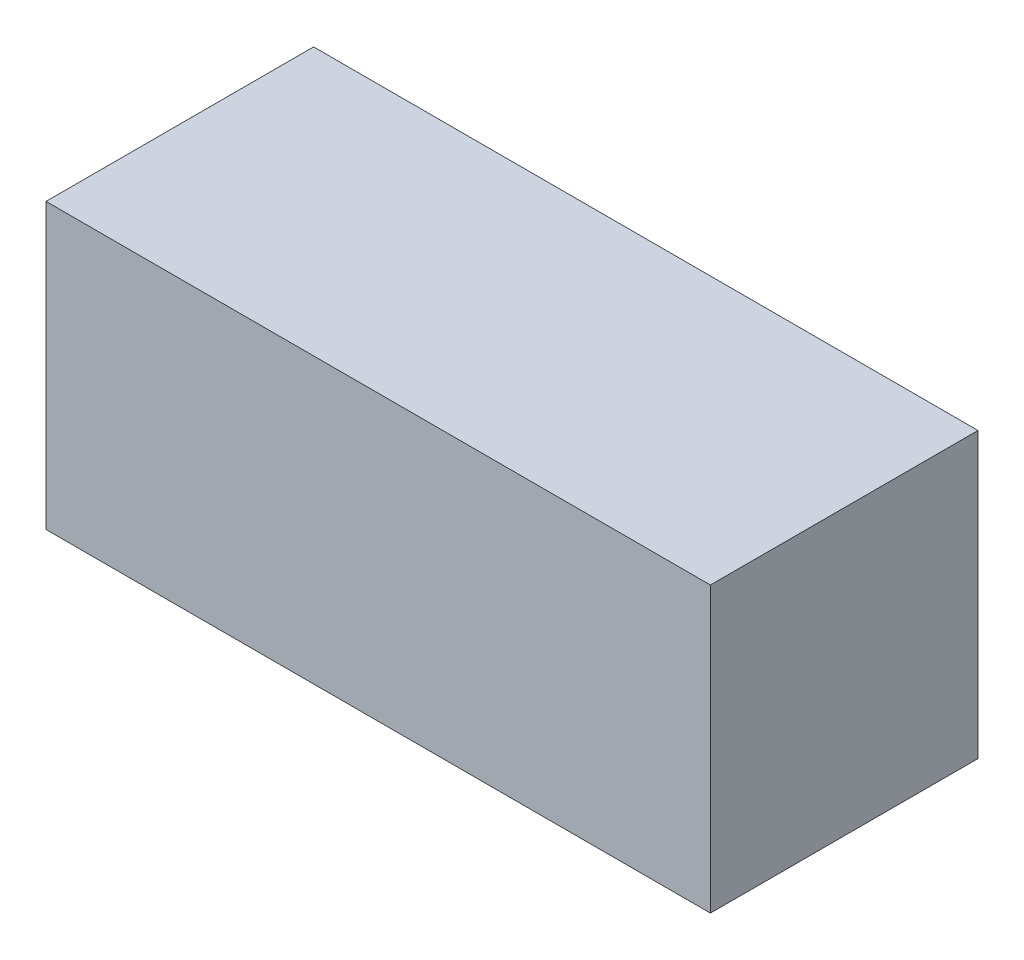
ISO-10303-21;
HEADER;
FILE_DESCRIPTION(('STEP AP214'),'2;1');
FILE_NAME('part.step','',(''),(''),'','','');
FILE_SCHEMA(('AUTOMOTIVE_DESIGN { 1 0 10303 214 1 1 1 1 }'));
ENDSEC;
DATA;
#1=APPLICATION_CONTEXT('core data for automotive mechanical design processes');
#2=APPLICATION_PROTOCOL_DEFINITION('international standard','automotive_design',2000,#1);
#3=PRODUCT_CONTEXT('',#1,'mechanical');
#4=PRODUCT('Part','Part','',(#3));
#5=PRODUCT_RELATED_PRODUCT_CATEGORY('part','',(#4));
#6=PRODUCT_DEFINITION_FORMATION('','',#4);
#7=PRODUCT_DEFINITION_CONTEXT('part definition',#1,'design');
#8=PRODUCT_DEFINITION('design','',#6,#7);
#9=PRODUCT_DEFINITION_SHAPE('','',#8);
#10=(LENGTH_UNIT() NAMED_UNIT(*) SI_UNIT(.MILLI.,.METRE.));
#11=(NAMED_UNIT(*) PLANE_ANGLE_UNIT() SI_UNIT($,.RADIAN.));
#12=(NAMED_UNIT(*) SI_UNIT($,.STERADIAN.) SOLID_ANGLE_UNIT());
#13=UNCERTAINTY_MEASURE_WITH_UNIT(LENGTH_MEASURE(1.E-05),#10,'distance_accuracy_value','');
#14=(GEOMETRIC_REPRESENTATION_CONTEXT(3) GLOBAL_UNCERTAINTY_ASSIGNED_CONTEXT((#13)) GLOBAL_UNIT_ASSIGNED_CONTEXT((#10,
#11,#12)) REPRESENTATION_CONTEXT('',''));
#15=CARTESIAN_POINT('',(0.,0.,0.));
#16=DIRECTION('',(0.,0.,1.));
#17=DIRECTION('',(1.,0.,0.));
#18=AXIS2_PLACEMENT_3D('',#15,#16,#17);
#19=CARTESIAN_POINT('',(0.,2591.,0.));
#20=DIRECTION('',(1.,0.,0.));
#21=DIRECTION('',(0.,0.,-1.));
#22=AXIS2_PLACEMENT_3D('',#19,#20,#21);
#23=PLANE('',#22);
#24=DIRECTION('',(0.,0.,1.));
#25=VECTOR('',#24,1.);
#26=CARTESIAN_POINT('',(0.,0.,0.));
#27=LINE('',#26,#25);
#28=CARTESIAN_POINT('',(0.,0.,-2440.));
#29=VERTEX_POINT('',#28);
#30=CARTESIAN_POINT('',(0.,0.,0.));
#31=VERTEX_POINT('',#30);
#32=EDGE_CURVE('E97',#29,#31,#27,.T.);
#33=ORIENTED_EDGE('',*,*,#32,.T.);
#34=DIRECTION('',(0.,-1.,0.));
#35=VECTOR('',#34,1.);
#36=CARTESIAN_POINT('',(0.,2591.,0.));
#37=LINE('',#36,#35);
#38=CARTESIAN_POINT('',(0.,2591.,0.));
#39=VERTEX_POINT('',#38);
#40=EDGE_CURVE('E11',#39,#31,#37,.T.);
#41=ORIENTED_EDGE('',*,*,#40,.F.);
#42=DIRECTION('',(0.,0.,1.));
#43=VECTOR('',#42,1.);
#44=CARTESIAN_POINT('',(0.,2591.,0.));
#45=LINE('',#44,#43);
#46=CARTESIAN_POINT('',(0.,2591.,-2440.));
#47=VERTEX_POINT('',#46);
#48=EDGE_CURVE('E85',#47,#39,#45,.T.);
#49=ORIENTED_EDGE('',*,*,#48,.F.);
#50=DIRECTION('',(0.,-1.,0.));
#51=VECTOR('',#50,1.);
#52=CARTESIAN_POINT('',(0.,2591.,-2440.));
#53=LINE('',#52,#51);
#54=EDGE_CURVE('E93',#47,#29,#53,.T.);
#55=ORIENTED_EDGE('',*,*,#54,.T.);
#56=EDGE_LOOP('',(#33,#41,#49,#55));
#57=FACE_BOUND('',#56,.T.);
#58=ADVANCED_FACE('F34',(#57),#23,.F.);
#59=CARTESIAN_POINT('',(0.,2591.,0.));
#60=DIRECTION('',(0.,0.,-1.));
#61=DIRECTION('',(-1.,0.,0.));
#62=AXIS2_PLACEMENT_3D('',#59,#60,#61);
#63=PLANE('',#62);
#64=DIRECTION('',(1.,0.,0.));
#65=VECTOR('',#64,1.);
#66=CARTESIAN_POINT('',(0.,0.,0.));
#67=LINE('',#66,#65);
#68=CARTESIAN_POINT('',(6058.,0.,0.));
#69=VERTEX_POINT('',#68);
#70=EDGE_CURVE('E89',#31,#69,#67,.T.);
#71=ORIENTED_EDGE('',*,*,#70,.T.);
#72=DIRECTION('',(0.,-1.,0.));
#73=VECTOR('',#72,1.);
#74=CARTESIAN_POINT('',(6058.,2591.,0.));
#75=LINE('',#74,#73);
#76=CARTESIAN_POINT('',(6058.,2591.,0.));
#77=VERTEX_POINT('',#76);
#78=EDGE_CURVE('E42',#77,#69,#75,.T.);
#79=ORIENTED_EDGE('',*,*,#78,.F.);
#80=DIRECTION('',(1.,0.,0.));
#81=VECTOR('',#80,1.);
#82=CARTESIAN_POINT('',(0.,2591.,0.));
#83=LINE('',#82,#81);
#84=EDGE_CURVE('E80',#39,#77,#83,.T.);
#85=ORIENTED_EDGE('',*,*,#84,.F.);
#86=ORIENTED_EDGE('',*,*,#40,.T.);
#87=EDGE_LOOP('',(#71,#79,#85,#86));
#88=FACE_BOUND('',#87,.T.);
#89=ADVANCED_FACE('F88',(#88),#63,.F.);
#90=CARTESIAN_POINT('',(6058.,2591.,0.));
#91=DIRECTION('',(-1.,0.,0.));
#92=DIRECTION('',(0.,0.,1.));
#93=AXIS2_PLACEMENT_3D('',#90,#91,#92);
#94=PLANE('',#93);
#95=DIRECTION('',(0.,0.,-1.));
#96=VECTOR('',#95,1.);
#97=CARTESIAN_POINT('',(6058.,0.,0.));
#98=LINE('',#97,#96);
#99=CARTESIAN_POINT('',(6058.,0.,-2440.));
#100=VERTEX_POINT('',#99);
#101=EDGE_CURVE('E67',#69,#100,#98,.T.);
#102=ORIENTED_EDGE('',*,*,#101,.T.);
#103=DIRECTION('',(0.,-1.,0.));
#104=VECTOR('',#103,1.);
#105=CARTESIAN_POINT('',(6058.,2591.,-2440.));
#106=LINE('',#105,#104);
#107=CARTESIAN_POINT('',(6058.,2591.,-2440.));
#108=VERTEX_POINT('',#107);
#109=EDGE_CURVE('E90',#108,#100,#106,.T.);
#110=ORIENTED_EDGE('',*,*,#109,.F.);
#111=DIRECTION('',(0.,0.,-1.));
#112=VECTOR('',#111,1.);
#113=CARTESIAN_POINT('',(6058.,2591.,0.));
#114=LINE('',#113,#112);
#115=EDGE_CURVE('E83',#77,#108,#114,.T.);
#116=ORIENTED_EDGE('',*,*,#115,.F.);
#117=ORIENTED_EDGE('',*,*,#78,.T.);
#118=EDGE_LOOP('',(#102,#110,#116,#117));
#119=FACE_BOUND('',#118,.T.);
#120=ADVANCED_FACE('F91',(#119),#94,.F.);
#121=CARTESIAN_POINT('',(0.,2591.,-2440.));
#122=DIRECTION('',(0.,0.,1.));
#123=DIRECTION('',(1.,0.,0.));
#124=AXIS2_PLACEMENT_3D('',#121,#122,#123);
#125=PLANE('',#124);
#126=DIRECTION('',(-1.,0.,0.));
#127=VECTOR('',#126,1.);
#128=CARTESIAN_POINT('',(0.,0.,-2440.));
#129=LINE('',#128,#127);
#130=EDGE_CURVE('E73',#100,#29,#129,.T.);
#131=ORIENTED_EDGE('',*,*,#130,.T.);
#132=ORIENTED_EDGE('',*,*,#54,.F.);
#133=DIRECTION('',(-1.,0.,0.));
#134=VECTOR('',#133,1.);
#135=CARTESIAN_POINT('',(0.,2591.,-2440.));
#136=LINE('',#135,#134);
#137=EDGE_CURVE('E50',#108,#47,#136,.T.);
#138=ORIENTED_EDGE('',*,*,#137,.F.);
#139=ORIENTED_EDGE('',*,*,#109,.T.);
#140=EDGE_LOOP('',(#131,#132,#138,#139));
#141=FACE_BOUND('',#140,.T.);
#142=ADVANCED_FACE('F104',(#141),#125,.F.);
#143=CARTESIAN_POINT('',(0.,2591.,0.));
#144=DIRECTION('',(0.,-1.,0.));
#145=DIRECTION('',(0.,0.,-1.));
#146=AXIS2_PLACEMENT_3D('',#143,#144,#145);
#147=PLANE('',#146);
#148=ORIENTED_EDGE('',*,*,#48,.T.);
#149=ORIENTED_EDGE('',*,*,#84,.T.);
#150=ORIENTED_EDGE('',*,*,#115,.T.);
#151=ORIENTED_EDGE('',*,*,#137,.T.);
#152=EDGE_LOOP('',(#148,#149,#150,#151));
#153=FACE_BOUND('',#152,.T.);
#154=ADVANCED_FACE('F81',(#153),#147,.F.);
#155=CARTESIAN_POINT('',(0.,0.,0.));
#156=DIRECTION('',(0.,-1.,0.));
#157=DIRECTION('',(0.,0.,-1.));
#158=AXIS2_PLACEMENT_3D('',#155,#156,#157);
#159=PLANE('',#158);
#160=ORIENTED_EDGE('',*,*,#32,.F.);
#161=ORIENTED_EDGE('',*,*,#130,.F.);
#162=ORIENTED_EDGE('',*,*,#101,.F.);
#163=ORIENTED_EDGE('',*,*,#70,.F.);
#164=EDGE_LOOP('',(#160,#161,#162,#163));
#165=FACE_BOUND('',#164,.T.);
#166=ADVANCED_FACE('F107',(#165),#159,.T.);
#167=CLOSED_SHELL('',(#58,#89,#120,#142,#154,#166));
#168=MANIFOLD_SOLID_BREP('B2',#167);
#169=ADVANCED_BREP_SHAPE_REPRESENTATION('',(#18,#168),#14);
#170=SHAPE_DEFINITION_REPRESENTATION(#9,#169);
ENDSEC;
END-ISO-10303-21;
